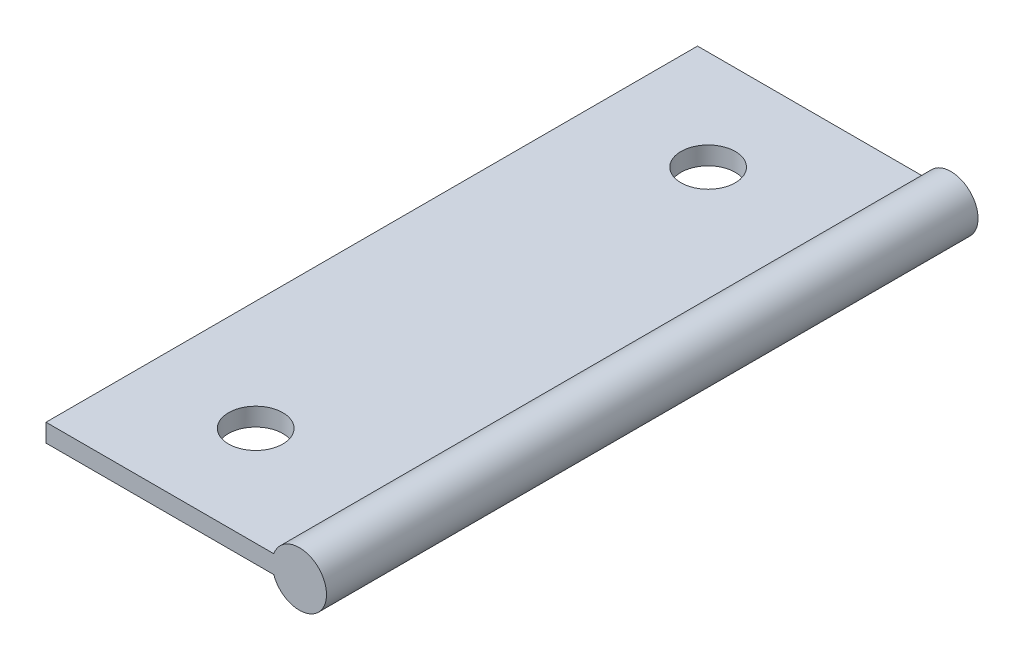
ISO-10303-21;
HEADER;
FILE_DESCRIPTION(('STEP AP214'),'2;1');
FILE_NAME('part.step','',(''),(''),'','','');
FILE_SCHEMA(('AUTOMOTIVE_DESIGN { 1 0 10303 214 1 1 1 1 }'));
ENDSEC;
DATA;
#1=APPLICATION_CONTEXT('core data for automotive mechanical design processes');
#2=APPLICATION_PROTOCOL_DEFINITION('international standard','automotive_design',2000,#1);
#3=PRODUCT_CONTEXT('',#1,'mechanical');
#4=PRODUCT('Part','Part','',(#3));
#5=PRODUCT_RELATED_PRODUCT_CATEGORY('part','',(#4));
#6=PRODUCT_DEFINITION_FORMATION('','',#4);
#7=PRODUCT_DEFINITION_CONTEXT('part definition',#1,'design');
#8=PRODUCT_DEFINITION('design','',#6,#7);
#9=PRODUCT_DEFINITION_SHAPE('','',#8);
#10=(LENGTH_UNIT() NAMED_UNIT(*) SI_UNIT(.MILLI.,.METRE.));
#11=(NAMED_UNIT(*) PLANE_ANGLE_UNIT() SI_UNIT($,.RADIAN.));
#12=(NAMED_UNIT(*) SI_UNIT($,.STERADIAN.) SOLID_ANGLE_UNIT());
#13=UNCERTAINTY_MEASURE_WITH_UNIT(LENGTH_MEASURE(1.E-05),#10,'distance_accuracy_value','');
#14=(GEOMETRIC_REPRESENTATION_CONTEXT(3) GLOBAL_UNCERTAINTY_ASSIGNED_CONTEXT((#13)) GLOBAL_UNIT_ASSIGNED_CONTEXT((#10,
#11,#12)) REPRESENTATION_CONTEXT('',''));
#15=CARTESIAN_POINT('',(0.,0.,0.));
#16=DIRECTION('',(0.,0.,1.));
#17=DIRECTION('',(1.,0.,0.));
#18=AXIS2_PLACEMENT_3D('',#15,#16,#17);
#19=CARTESIAN_POINT('',(0.,0.,36.));
#20=DIRECTION('',(0.,0.,-1.));
#21=DIRECTION('',(-1.,0.,0.));
#22=AXIS2_PLACEMENT_3D('',#19,#20,#21);
#23=CYLINDRICAL_SURFACE('',#22,1.5);
#24=CARTESIAN_POINT('',(0.,0.,0.));
#25=DIRECTION('',(0.,0.,1.));
#26=DIRECTION('',(1.,0.,0.));
#27=AXIS2_PLACEMENT_3D('',#24,#25,#26);
#28=CIRCLE('',#27,1.5);
#29=CARTESIAN_POINT('',(-1.41421356237309,-0.5,0.));
#30=VERTEX_POINT('',#29);
#31=CARTESIAN_POINT('',(-1.41421356237309,0.5,0.));
#32=VERTEX_POINT('',#31);
#33=EDGE_CURVE('E100',#30,#32,#28,.T.);
#34=ORIENTED_EDGE('',*,*,#33,.T.);
#35=DIRECTION('',(0.,0.,-1.));
#36=VECTOR('',#35,1.);
#37=CARTESIAN_POINT('',(-1.41421356237309,0.5,36.));
#38=LINE('',#37,#36);
#39=CARTESIAN_POINT('',(-1.41421356237309,0.5,36.));
#40=VERTEX_POINT('',#39);
#41=EDGE_CURVE('E11',#40,#32,#38,.T.);
#42=ORIENTED_EDGE('',*,*,#41,.F.);
#43=CARTESIAN_POINT('',(0.,0.,36.));
#44=DIRECTION('',(0.,0.,1.));
#45=DIRECTION('',(1.,0.,0.));
#46=AXIS2_PLACEMENT_3D('',#43,#44,#45);
#47=CIRCLE('',#46,1.5);
#48=CARTESIAN_POINT('',(-1.41421356237309,-0.5,36.));
#49=VERTEX_POINT('',#48);
#50=EDGE_CURVE('E87',#49,#40,#47,.T.);
#51=ORIENTED_EDGE('',*,*,#50,.F.);
#52=DIRECTION('',(0.,0.,-1.));
#53=VECTOR('',#52,1.);
#54=CARTESIAN_POINT('',(-1.41421356237309,-0.5,36.));
#55=LINE('',#54,#53);
#56=EDGE_CURVE('E96',#49,#30,#55,.T.);
#57=ORIENTED_EDGE('',*,*,#56,.T.);
#58=EDGE_LOOP('',(#34,#42,#51,#57));
#59=FACE_BOUND('',#58,.T.);
#60=ADVANCED_FACE('F34',(#59),#23,.T.);
#61=CARTESIAN_POINT('',(-1.41421356237309,0.5,36.));
#62=DIRECTION('',(0.,-1.,0.));
#63=DIRECTION('',(1.,0.,0.));
#64=AXIS2_PLACEMENT_3D('',#61,#62,#63);
#65=PLANE('',#64);
#66=CARTESIAN_POINT('',(-7.9142135623731,0.5,30.5));
#67=DIRECTION('',(0.,1.,0.));
#68=DIRECTION('',(0.,0.,1.));
#69=AXIS2_PLACEMENT_3D('',#66,#67,#68);
#70=CIRCLE('',#69,1.5);
#71=CARTESIAN_POINT('',(-7.9142135623731,0.5,32.));
#72=VERTEX_POINT('',#71);
#73=EDGE_CURVE('E117',#72,#72,#70,.T.);
#74=ORIENTED_EDGE('',*,*,#73,.F.);
#75=EDGE_LOOP('',(#74));
#76=FACE_BOUND('',#75,.T.);
#77=CARTESIAN_POINT('',(-7.9142135623731,0.5,5.5));
#78=DIRECTION('',(0.,1.,0.));
#79=DIRECTION('',(0.,0.,-1.));
#80=AXIS2_PLACEMENT_3D('',#77,#78,#79);
#81=CIRCLE('',#80,1.5);
#82=CARTESIAN_POINT('',(-7.9142135623731,0.5,4.));
#83=VERTEX_POINT('',#82);
#84=EDGE_CURVE('E109',#83,#83,#81,.T.);
#85=ORIENTED_EDGE('',*,*,#84,.F.);
#86=EDGE_LOOP('',(#85));
#87=FACE_BOUND('',#86,.T.);
#88=DIRECTION('',(-1.,0.,0.));
#89=VECTOR('',#88,1.);
#90=CARTESIAN_POINT('',(-1.41421356237309,0.5,0.));
#91=LINE('',#90,#89);
#92=CARTESIAN_POINT('',(-14.,0.5,0.));
#93=VERTEX_POINT('',#92);
#94=EDGE_CURVE('E91',#32,#93,#91,.T.);
#95=ORIENTED_EDGE('',*,*,#94,.T.);
#96=DIRECTION('',(0.,0.,-1.));
#97=VECTOR('',#96,1.);
#98=CARTESIAN_POINT('',(-14.,0.5,36.));
#99=LINE('',#98,#97);
#100=CARTESIAN_POINT('',(-14.,0.5,36.));
#101=VERTEX_POINT('',#100);
#102=EDGE_CURVE('E43',#101,#93,#99,.T.);
#103=ORIENTED_EDGE('',*,*,#102,.F.);
#104=DIRECTION('',(-1.,0.,0.));
#105=VECTOR('',#104,1.);
#106=CARTESIAN_POINT('',(-1.41421356237309,0.5,36.));
#107=LINE('',#106,#105);
#108=EDGE_CURVE('E82',#40,#101,#107,.T.);
#109=ORIENTED_EDGE('',*,*,#108,.F.);
#110=ORIENTED_EDGE('',*,*,#41,.T.);
#111=EDGE_LOOP('',(#95,#103,#109,#110));
#112=FACE_BOUND('',#111,.T.);
#113=ADVANCED_FACE('F90',(#76,#87,#112),#65,.F.);
#114=CARTESIAN_POINT('',(-14.,0.5,36.));
#115=DIRECTION('',(1.,0.,0.));
#116=DIRECTION('',(0.,0.,-1.));
#117=AXIS2_PLACEMENT_3D('',#114,#115,#116);
#118=PLANE('',#117);
#119=DIRECTION('',(0.,-1.,0.));
#120=VECTOR('',#119,1.);
#121=CARTESIAN_POINT('',(-14.,0.5,0.));
#122=LINE('',#121,#120);
#123=CARTESIAN_POINT('',(-14.,-0.5,0.));
#124=VERTEX_POINT('',#123);
#125=EDGE_CURVE('E69',#93,#124,#122,.T.);
#126=ORIENTED_EDGE('',*,*,#125,.T.);
#127=DIRECTION('',(0.,0.,-1.));
#128=VECTOR('',#127,1.);
#129=CARTESIAN_POINT('',(-14.,-0.5,36.));
#130=LINE('',#129,#128);
#131=CARTESIAN_POINT('',(-14.,-0.5,36.));
#132=VERTEX_POINT('',#131);
#133=EDGE_CURVE('E92',#132,#124,#130,.T.);
#134=ORIENTED_EDGE('',*,*,#133,.F.);
#135=DIRECTION('',(0.,-1.,0.));
#136=VECTOR('',#135,1.);
#137=CARTESIAN_POINT('',(-14.,0.5,36.));
#138=LINE('',#137,#136);
#139=EDGE_CURVE('E85',#101,#132,#138,.T.);
#140=ORIENTED_EDGE('',*,*,#139,.F.);
#141=ORIENTED_EDGE('',*,*,#102,.T.);
#142=EDGE_LOOP('',(#126,#134,#140,#141));
#143=FACE_BOUND('',#142,.T.);
#144=ADVANCED_FACE('F94',(#143),#118,.F.);
#145=CARTESIAN_POINT('',(-14.,-0.5,36.));
#146=DIRECTION('',(0.,1.,0.));
#147=DIRECTION('',(-1.,0.,0.));
#148=AXIS2_PLACEMENT_3D('',#145,#146,#147);
#149=PLANE('',#148);
#150=CARTESIAN_POINT('',(-7.9142135623731,-0.5,30.5));
#151=DIRECTION('',(0.,1.,0.));
#152=DIRECTION('',(-1.,0.,0.));
#153=AXIS2_PLACEMENT_3D('',#150,#151,#152);
#154=CIRCLE('',#153,1.5);
#155=CARTESIAN_POINT('',(-9.4142135623731,-0.5,30.5));
#156=VERTEX_POINT('',#155);
#157=EDGE_CURVE('E37',#156,#156,#154,.T.);
#158=ORIENTED_EDGE('',*,*,#157,.T.);
#159=EDGE_LOOP('',(#158));
#160=FACE_BOUND('',#159,.T.);
#161=CARTESIAN_POINT('',(-7.9142135623731,-0.5,5.5));
#162=DIRECTION('',(0.,1.,0.));
#163=DIRECTION('',(-1.,0.,0.));
#164=AXIS2_PLACEMENT_3D('',#161,#162,#163);
#165=CIRCLE('',#164,1.5);
#166=CARTESIAN_POINT('',(-9.4142135623731,-0.5,5.5));
#167=VERTEX_POINT('',#166);
#168=EDGE_CURVE('E103',#167,#167,#165,.T.);
#169=ORIENTED_EDGE('',*,*,#168,.T.);
#170=EDGE_LOOP('',(#169));
#171=FACE_BOUND('',#170,.T.);
#172=DIRECTION('',(1.,0.,0.));
#173=VECTOR('',#172,1.);
#174=CARTESIAN_POINT('',(-14.,-0.5,0.));
#175=LINE('',#174,#173);
#176=EDGE_CURVE('E75',#124,#30,#175,.T.);
#177=ORIENTED_EDGE('',*,*,#176,.T.);
#178=ORIENTED_EDGE('',*,*,#56,.F.);
#179=DIRECTION('',(1.,0.,0.));
#180=VECTOR('',#179,1.);
#181=CARTESIAN_POINT('',(-14.,-0.5,36.));
#182=LINE('',#181,#180);
#183=EDGE_CURVE('E52',#132,#49,#182,.T.);
#184=ORIENTED_EDGE('',*,*,#183,.F.);
#185=ORIENTED_EDGE('',*,*,#133,.T.);
#186=EDGE_LOOP('',(#177,#178,#184,#185));
#187=FACE_BOUND('',#186,.T.);
#188=ADVANCED_FACE('F131',(#160,#171,#187),#149,.F.);
#189=CARTESIAN_POINT('',(0.,0.,36.));
#190=DIRECTION('',(0.,0.,1.));
#191=DIRECTION('',(1.,0.,0.));
#192=AXIS2_PLACEMENT_3D('',#189,#190,#191);
#193=PLANE('',#192);
#194=ORIENTED_EDGE('',*,*,#50,.T.);
#195=ORIENTED_EDGE('',*,*,#108,.T.);
#196=ORIENTED_EDGE('',*,*,#139,.T.);
#197=ORIENTED_EDGE('',*,*,#183,.T.);
#198=EDGE_LOOP('',(#194,#195,#196,#197));
#199=FACE_BOUND('',#198,.T.);
#200=ADVANCED_FACE('F83',(#199),#193,.T.);
#201=CARTESIAN_POINT('',(0.,0.,0.));
#202=DIRECTION('',(0.,0.,1.));
#203=DIRECTION('',(1.,0.,0.));
#204=AXIS2_PLACEMENT_3D('',#201,#202,#203);
#205=PLANE('',#204);
#206=ORIENTED_EDGE('',*,*,#33,.F.);
#207=ORIENTED_EDGE('',*,*,#176,.F.);
#208=ORIENTED_EDGE('',*,*,#125,.F.);
#209=ORIENTED_EDGE('',*,*,#94,.F.);
#210=EDGE_LOOP('',(#206,#207,#208,#209));
#211=FACE_BOUND('',#210,.T.);
#212=ADVANCED_FACE('F138',(#211),#205,.F.);
#213=CARTESIAN_POINT('',(-7.9142135623731,-1.5,5.5));
#214=DIRECTION('',(0.,1.,0.));
#215=DIRECTION('',(0.,0.,1.));
#216=AXIS2_PLACEMENT_3D('',#213,#214,#215);
#217=CYLINDRICAL_SURFACE('',#216,1.5);
#218=ORIENTED_EDGE('',*,*,#84,.T.);
#219=EDGE_LOOP('',(#218));
#220=FACE_BOUND('',#219,.T.);
#221=ORIENTED_EDGE('',*,*,#168,.F.);
#222=EDGE_LOOP('',(#221));
#223=FACE_BOUND('',#222,.T.);
#224=ADVANCED_FACE('F141',(#220,#223),#217,.F.);
#225=CARTESIAN_POINT('',(-7.9142135623731,-1.5,30.5));
#226=DIRECTION('',(0.,1.,0.));
#227=DIRECTION('',(0.,0.,1.));
#228=AXIS2_PLACEMENT_3D('',#225,#226,#227);
#229=CYLINDRICAL_SURFACE('',#228,1.5);
#230=ORIENTED_EDGE('',*,*,#73,.T.);
#231=EDGE_LOOP('',(#230));
#232=FACE_BOUND('',#231,.T.);
#233=ORIENTED_EDGE('',*,*,#157,.F.);
#234=EDGE_LOOP('',(#233));
#235=FACE_BOUND('',#234,.T.);
#236=ADVANCED_FACE('F122',(#232,#235),#229,.F.);
#237=CLOSED_SHELL('',(#60,#113,#144,#188,#200,#212,#224,#236));
#238=MANIFOLD_SOLID_BREP('B2',#237);
#239=ADVANCED_BREP_SHAPE_REPRESENTATION('',(#18,#238),#14);
#240=SHAPE_DEFINITION_REPRESENTATION(#9,#239);
ENDSEC;
END-ISO-10303-21;
